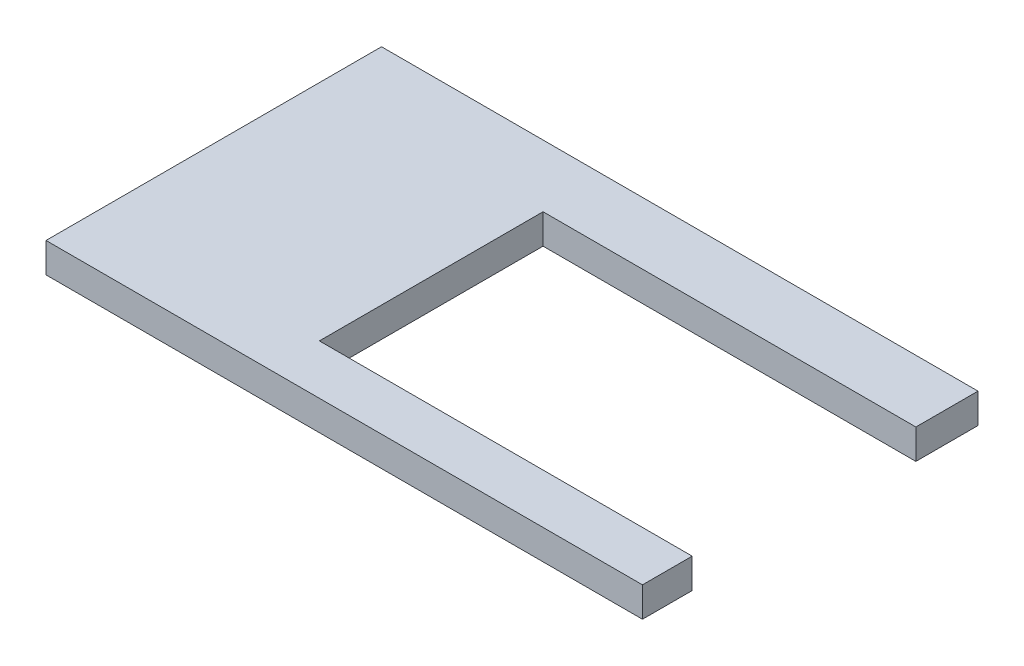
ISO-10303-21;
HEADER;
FILE_DESCRIPTION(('STEP AP214'),'2;1');
FILE_NAME('part.step','',(''),(''),'','','');
FILE_SCHEMA(('AUTOMOTIVE_DESIGN { 1 0 10303 214 1 1 1 1 }'));
ENDSEC;
DATA;
#1=APPLICATION_CONTEXT('core data for automotive mechanical design processes');
#2=APPLICATION_PROTOCOL_DEFINITION('international standard','automotive_design',2000,#1);
#3=PRODUCT_CONTEXT('',#1,'mechanical');
#4=PRODUCT('Part','Part','',(#3));
#5=PRODUCT_RELATED_PRODUCT_CATEGORY('part','',(#4));
#6=PRODUCT_DEFINITION_FORMATION('','',#4);
#7=PRODUCT_DEFINITION_CONTEXT('part definition',#1,'design');
#8=PRODUCT_DEFINITION('design','',#6,#7);
#9=PRODUCT_DEFINITION_SHAPE('','',#8);
#10=(LENGTH_UNIT() NAMED_UNIT(*) SI_UNIT(.MILLI.,.METRE.));
#11=(NAMED_UNIT(*) PLANE_ANGLE_UNIT() SI_UNIT($,.RADIAN.));
#12=(NAMED_UNIT(*) SI_UNIT($,.STERADIAN.) SOLID_ANGLE_UNIT());
#13=UNCERTAINTY_MEASURE_WITH_UNIT(LENGTH_MEASURE(1.E-05),#10,'distance_accuracy_value','');
#14=(GEOMETRIC_REPRESENTATION_CONTEXT(3) GLOBAL_UNCERTAINTY_ASSIGNED_CONTEXT((#13)) GLOBAL_UNIT_ASSIGNED_CONTEXT((#10,
#11,#12)) REPRESENTATION_CONTEXT('',''));
#15=CARTESIAN_POINT('',(0.,0.,0.));
#16=DIRECTION('',(0.,0.,1.));
#17=DIRECTION('',(1.,0.,0.));
#18=AXIS2_PLACEMENT_3D('',#15,#16,#17);
#19=CARTESIAN_POINT('',(24.765,1.524,0.));
#20=DIRECTION('',(1.,0.,0.));
#21=DIRECTION('',(0.,0.,-1.));
#22=AXIS2_PLACEMENT_3D('',#19,#20,#21);
#23=PLANE('',#22);
#24=DIRECTION('',(0.,0.,1.));
#25=VECTOR('',#24,1.);
#26=CARTESIAN_POINT('',(24.765,0.,0.));
#27=LINE('',#26,#25);
#28=CARTESIAN_POINT('',(24.765,0.,6.0325));
#29=VERTEX_POINT('',#28);
#30=CARTESIAN_POINT('',(24.765,0.,8.5725));
#31=VERTEX_POINT('',#30);
#32=EDGE_CURVE('E126',#29,#31,#27,.T.);
#33=ORIENTED_EDGE('',*,*,#32,.F.);
#34=DIRECTION('',(0.,-1.,0.));
#35=VECTOR('',#34,1.);
#36=CARTESIAN_POINT('',(24.765,1.524,6.0325));
#37=LINE('',#36,#35);
#38=CARTESIAN_POINT('',(24.765,1.524,6.0325));
#39=VERTEX_POINT('',#38);
#40=EDGE_CURVE('E11',#39,#29,#37,.T.);
#41=ORIENTED_EDGE('',*,*,#40,.F.);
#42=DIRECTION('',(0.,0.,1.));
#43=VECTOR('',#42,1.);
#44=CARTESIAN_POINT('',(24.765,1.524,0.));
#45=LINE('',#44,#43);
#46=CARTESIAN_POINT('',(24.765,1.524,8.5725));
#47=VERTEX_POINT('',#46);
#48=EDGE_CURVE('E145',#39,#47,#45,.T.);
#49=ORIENTED_EDGE('',*,*,#48,.T.);
#50=DIRECTION('',(0.,-1.,0.));
#51=VECTOR('',#50,1.);
#52=CARTESIAN_POINT('',(24.765,1.524,8.5725));
#53=LINE('',#52,#51);
#54=EDGE_CURVE('E86',#47,#31,#53,.T.);
#55=ORIENTED_EDGE('',*,*,#54,.T.);
#56=EDGE_LOOP('',(#33,#41,#49,#55));
#57=FACE_BOUND('',#56,.T.);
#58=ADVANCED_FACE('F35',(#57),#23,.T.);
#59=CARTESIAN_POINT('',(0.,1.524,6.0325));
#60=DIRECTION('',(0.,0.,-1.));
#61=DIRECTION('',(-1.,0.,0.));
#62=AXIS2_PLACEMENT_3D('',#59,#60,#61);
#63=PLANE('',#62);
#64=DIRECTION('',(1.,0.,0.));
#65=VECTOR('',#64,1.);
#66=CARTESIAN_POINT('',(0.,0.,6.0325));
#67=LINE('',#66,#65);
#68=CARTESIAN_POINT('',(5.715,0.,6.0325));
#69=VERTEX_POINT('',#68);
#70=EDGE_CURVE('E129',#69,#29,#67,.T.);
#71=ORIENTED_EDGE('',*,*,#70,.F.);
#72=DIRECTION('',(0.,-1.,0.));
#73=VECTOR('',#72,1.);
#74=CARTESIAN_POINT('',(5.715,1.524,6.0325));
#75=LINE('',#74,#73);
#76=CARTESIAN_POINT('',(5.715,1.524,6.0325));
#77=VERTEX_POINT('',#76);
#78=EDGE_CURVE('E43',#77,#69,#75,.T.);
#79=ORIENTED_EDGE('',*,*,#78,.F.);
#80=DIRECTION('',(1.,0.,0.));
#81=VECTOR('',#80,1.);
#82=CARTESIAN_POINT('',(0.,1.524,6.0325));
#83=LINE('',#82,#81);
#84=EDGE_CURVE('E173',#77,#39,#83,.T.);
#85=ORIENTED_EDGE('',*,*,#84,.T.);
#86=ORIENTED_EDGE('',*,*,#40,.T.);
#87=EDGE_LOOP('',(#71,#79,#85,#86));
#88=FACE_BOUND('',#87,.T.);
#89=ADVANCED_FACE('F162',(#88),#63,.T.);
#90=CARTESIAN_POINT('',(5.715,1.524,0.));
#91=DIRECTION('',(1.,0.,0.));
#92=DIRECTION('',(0.,0.,-1.));
#93=AXIS2_PLACEMENT_3D('',#90,#91,#92);
#94=PLANE('',#93);
#95=DIRECTION('',(0.,0.,1.));
#96=VECTOR('',#95,1.);
#97=CARTESIAN_POINT('',(5.715,0.,0.));
#98=LINE('',#97,#96);
#99=CARTESIAN_POINT('',(5.715,0.,-5.3975));
#100=VERTEX_POINT('',#99);
#101=EDGE_CURVE('E132',#100,#69,#98,.T.);
#102=ORIENTED_EDGE('',*,*,#101,.F.);
#103=DIRECTION('',(0.,-1.,0.));
#104=VECTOR('',#103,1.);
#105=CARTESIAN_POINT('',(5.715,1.524,-5.3975));
#106=LINE('',#105,#104);
#107=CARTESIAN_POINT('',(5.715,1.524,-5.3975));
#108=VERTEX_POINT('',#107);
#109=EDGE_CURVE('E151',#108,#100,#106,.T.);
#110=ORIENTED_EDGE('',*,*,#109,.F.);
#111=DIRECTION('',(0.,0.,1.));
#112=VECTOR('',#111,1.);
#113=CARTESIAN_POINT('',(5.715,1.524,0.));
#114=LINE('',#113,#112);
#115=EDGE_CURVE('E158',#108,#77,#114,.T.);
#116=ORIENTED_EDGE('',*,*,#115,.T.);
#117=ORIENTED_EDGE('',*,*,#78,.T.);
#118=EDGE_LOOP('',(#102,#110,#116,#117));
#119=FACE_BOUND('',#118,.T.);
#120=ADVANCED_FACE('F156',(#119),#94,.T.);
#121=CARTESIAN_POINT('',(0.,1.524,-5.3975));
#122=DIRECTION('',(0.,0.,-1.));
#123=DIRECTION('',(-1.,0.,0.));
#124=AXIS2_PLACEMENT_3D('',#121,#122,#123);
#125=PLANE('',#124);
#126=DIRECTION('',(1.,0.,0.));
#127=VECTOR('',#126,1.);
#128=CARTESIAN_POINT('',(0.,0.,-5.3975));
#129=LINE('',#128,#127);
#130=CARTESIAN_POINT('',(24.765,0.,-5.3975));
#131=VERTEX_POINT('',#130);
#132=EDGE_CURVE('E135',#100,#131,#129,.T.);
#133=ORIENTED_EDGE('',*,*,#132,.T.);
#134=DIRECTION('',(0.,-1.,0.));
#135=VECTOR('',#134,1.);
#136=CARTESIAN_POINT('',(24.765,1.524,-5.3975));
#137=LINE('',#136,#135);
#138=CARTESIAN_POINT('',(24.765,1.524,-5.3975));
#139=VERTEX_POINT('',#138);
#140=EDGE_CURVE('E149',#139,#131,#137,.T.);
#141=ORIENTED_EDGE('',*,*,#140,.F.);
#142=DIRECTION('',(1.,0.,0.));
#143=VECTOR('',#142,1.);
#144=CARTESIAN_POINT('',(0.,1.524,-5.3975));
#145=LINE('',#144,#143);
#146=EDGE_CURVE('E171',#108,#139,#145,.T.);
#147=ORIENTED_EDGE('',*,*,#146,.F.);
#148=ORIENTED_EDGE('',*,*,#109,.T.);
#149=EDGE_LOOP('',(#133,#141,#147,#148));
#150=FACE_BOUND('',#149,.T.);
#151=ADVANCED_FACE('F169',(#150),#125,.F.);
#152=CARTESIAN_POINT('',(24.765,1.524,0.));
#153=DIRECTION('',(1.,0.,0.));
#154=DIRECTION('',(0.,0.,-1.));
#155=AXIS2_PLACEMENT_3D('',#152,#153,#154);
#156=PLANE('',#155);
#157=DIRECTION('',(0.,0.,1.));
#158=VECTOR('',#157,1.);
#159=CARTESIAN_POINT('',(24.765,0.,0.));
#160=LINE('',#159,#158);
#161=CARTESIAN_POINT('',(24.765,0.,-8.5725));
#162=VERTEX_POINT('',#161);
#163=EDGE_CURVE('E138',#162,#131,#160,.T.);
#164=ORIENTED_EDGE('',*,*,#163,.F.);
#165=DIRECTION('',(0.,-1.,0.));
#166=VECTOR('',#165,1.);
#167=CARTESIAN_POINT('',(24.765,1.524,-8.5725));
#168=LINE('',#167,#166);
#169=CARTESIAN_POINT('',(24.765,1.524,-8.5725));
#170=VERTEX_POINT('',#169);
#171=EDGE_CURVE('E118',#170,#162,#168,.T.);
#172=ORIENTED_EDGE('',*,*,#171,.F.);
#173=DIRECTION('',(0.,0.,1.));
#174=VECTOR('',#173,1.);
#175=CARTESIAN_POINT('',(24.765,1.524,0.));
#176=LINE('',#175,#174);
#177=EDGE_CURVE('E111',#170,#139,#176,.T.);
#178=ORIENTED_EDGE('',*,*,#177,.T.);
#179=ORIENTED_EDGE('',*,*,#140,.T.);
#180=EDGE_LOOP('',(#164,#172,#178,#179));
#181=FACE_BOUND('',#180,.T.);
#182=ADVANCED_FACE('F178',(#181),#156,.T.);
#183=CARTESIAN_POINT('',(0.,1.524,-8.5725));
#184=DIRECTION('',(0.,0.,1.));
#185=DIRECTION('',(1.,0.,0.));
#186=AXIS2_PLACEMENT_3D('',#183,#184,#185);
#187=PLANE('',#186);
#188=DIRECTION('',(-1.,0.,0.));
#189=VECTOR('',#188,1.);
#190=CARTESIAN_POINT('',(0.,0.,-8.5725));
#191=LINE('',#190,#189);
#192=CARTESIAN_POINT('',(-5.715,0.,-8.5725));
#193=VERTEX_POINT('',#192);
#194=EDGE_CURVE('E117',#162,#193,#191,.T.);
#195=ORIENTED_EDGE('',*,*,#194,.T.);
#196=DIRECTION('',(0.,-1.,0.));
#197=VECTOR('',#196,1.);
#198=CARTESIAN_POINT('',(-5.715,1.524,-8.5725));
#199=LINE('',#198,#197);
#200=CARTESIAN_POINT('',(-5.715,1.524,-8.5725));
#201=VERTEX_POINT('',#200);
#202=EDGE_CURVE('E114',#201,#193,#199,.T.);
#203=ORIENTED_EDGE('',*,*,#202,.F.);
#204=DIRECTION('',(-1.,0.,0.));
#205=VECTOR('',#204,1.);
#206=CARTESIAN_POINT('',(0.,1.524,-8.5725));
#207=LINE('',#206,#205);
#208=EDGE_CURVE('E105',#170,#201,#207,.T.);
#209=ORIENTED_EDGE('',*,*,#208,.F.);
#210=ORIENTED_EDGE('',*,*,#171,.T.);
#211=EDGE_LOOP('',(#195,#203,#209,#210));
#212=FACE_BOUND('',#211,.T.);
#213=ADVANCED_FACE('F115',(#212),#187,.F.);
#214=CARTESIAN_POINT('',(-5.715,1.524,0.));
#215=DIRECTION('',(1.,0.,0.));
#216=DIRECTION('',(0.,0.,-1.));
#217=AXIS2_PLACEMENT_3D('',#214,#215,#216);
#218=PLANE('',#217);
#219=DIRECTION('',(0.,0.,1.));
#220=VECTOR('',#219,1.);
#221=CARTESIAN_POINT('',(-5.715,0.,0.));
#222=LINE('',#221,#220);
#223=CARTESIAN_POINT('',(-5.715,0.,8.5725));
#224=VERTEX_POINT('',#223);
#225=EDGE_CURVE('E79',#193,#224,#222,.T.);
#226=ORIENTED_EDGE('',*,*,#225,.T.);
#227=DIRECTION('',(0.,-1.,0.));
#228=VECTOR('',#227,1.);
#229=CARTESIAN_POINT('',(-5.715,1.524,8.5725));
#230=LINE('',#229,#228);
#231=CARTESIAN_POINT('',(-5.715,1.524,8.5725));
#232=VERTEX_POINT('',#231);
#233=EDGE_CURVE('E119',#232,#224,#230,.T.);
#234=ORIENTED_EDGE('',*,*,#233,.F.);
#235=DIRECTION('',(0.,0.,1.));
#236=VECTOR('',#235,1.);
#237=CARTESIAN_POINT('',(-5.715,1.524,0.));
#238=LINE('',#237,#236);
#239=EDGE_CURVE('E109',#201,#232,#238,.T.);
#240=ORIENTED_EDGE('',*,*,#239,.F.);
#241=ORIENTED_EDGE('',*,*,#202,.T.);
#242=EDGE_LOOP('',(#226,#234,#240,#241));
#243=FACE_BOUND('',#242,.T.);
#244=ADVANCED_FACE('F121',(#243),#218,.F.);
#245=CARTESIAN_POINT('',(0.,1.524,8.5725));
#246=DIRECTION('',(0.,0.,-1.));
#247=DIRECTION('',(-1.,0.,0.));
#248=AXIS2_PLACEMENT_3D('',#245,#246,#247);
#249=PLANE('',#248);
#250=DIRECTION('',(1.,0.,0.));
#251=VECTOR('',#250,1.);
#252=CARTESIAN_POINT('',(0.,0.,8.5725));
#253=LINE('',#252,#251);
#254=EDGE_CURVE('E143',#224,#31,#253,.T.);
#255=ORIENTED_EDGE('',*,*,#254,.T.);
#256=ORIENTED_EDGE('',*,*,#54,.F.);
#257=DIRECTION('',(1.,0.,0.));
#258=VECTOR('',#257,1.);
#259=CARTESIAN_POINT('',(0.,1.524,8.5725));
#260=LINE('',#259,#258);
#261=EDGE_CURVE('E51',#232,#47,#260,.T.);
#262=ORIENTED_EDGE('',*,*,#261,.F.);
#263=ORIENTED_EDGE('',*,*,#233,.T.);
#264=EDGE_LOOP('',(#255,#256,#262,#263));
#265=FACE_BOUND('',#264,.T.);
#266=ADVANCED_FACE('F181',(#265),#249,.F.);
#267=CARTESIAN_POINT('',(0.,1.524,0.));
#268=DIRECTION('',(0.,1.,0.));
#269=DIRECTION('',(0.,0.,1.));
#270=AXIS2_PLACEMENT_3D('',#267,#268,#269);
#271=PLANE('',#270);
#272=ORIENTED_EDGE('',*,*,#48,.F.);
#273=ORIENTED_EDGE('',*,*,#84,.F.);
#274=ORIENTED_EDGE('',*,*,#115,.F.);
#275=ORIENTED_EDGE('',*,*,#146,.T.);
#276=ORIENTED_EDGE('',*,*,#177,.F.);
#277=ORIENTED_EDGE('',*,*,#208,.T.);
#278=ORIENTED_EDGE('',*,*,#239,.T.);
#279=ORIENTED_EDGE('',*,*,#261,.T.);
#280=EDGE_LOOP('',(#272,#273,#274,#275,#276,#277,#278,#279));
#281=FACE_BOUND('',#280,.T.);
#282=ADVANCED_FACE('F107',(#281),#271,.T.);
#283=CARTESIAN_POINT('',(0.,0.,0.));
#284=DIRECTION('',(0.,1.,0.));
#285=DIRECTION('',(0.,0.,1.));
#286=AXIS2_PLACEMENT_3D('',#283,#284,#285);
#287=PLANE('',#286);
#288=ORIENTED_EDGE('',*,*,#32,.T.);
#289=ORIENTED_EDGE('',*,*,#254,.F.);
#290=ORIENTED_EDGE('',*,*,#225,.F.);
#291=ORIENTED_EDGE('',*,*,#194,.F.);
#292=ORIENTED_EDGE('',*,*,#163,.T.);
#293=ORIENTED_EDGE('',*,*,#132,.F.);
#294=ORIENTED_EDGE('',*,*,#101,.T.);
#295=ORIENTED_EDGE('',*,*,#70,.T.);
#296=EDGE_LOOP('',(#288,#289,#290,#291,#292,#293,#294,#295));
#297=FACE_BOUND('',#296,.T.);
#298=ADVANCED_FACE('F165',(#297),#287,.F.);
#299=CLOSED_SHELL('',(#58,#89,#120,#151,#182,#213,#244,#266,#282,#298));
#300=MANIFOLD_SOLID_BREP('B2',#299);
#301=ADVANCED_BREP_SHAPE_REPRESENTATION('',(#18,#300),#14);
#302=SHAPE_DEFINITION_REPRESENTATION(#9,#301);
ENDSEC;
END-ISO-10303-21;
